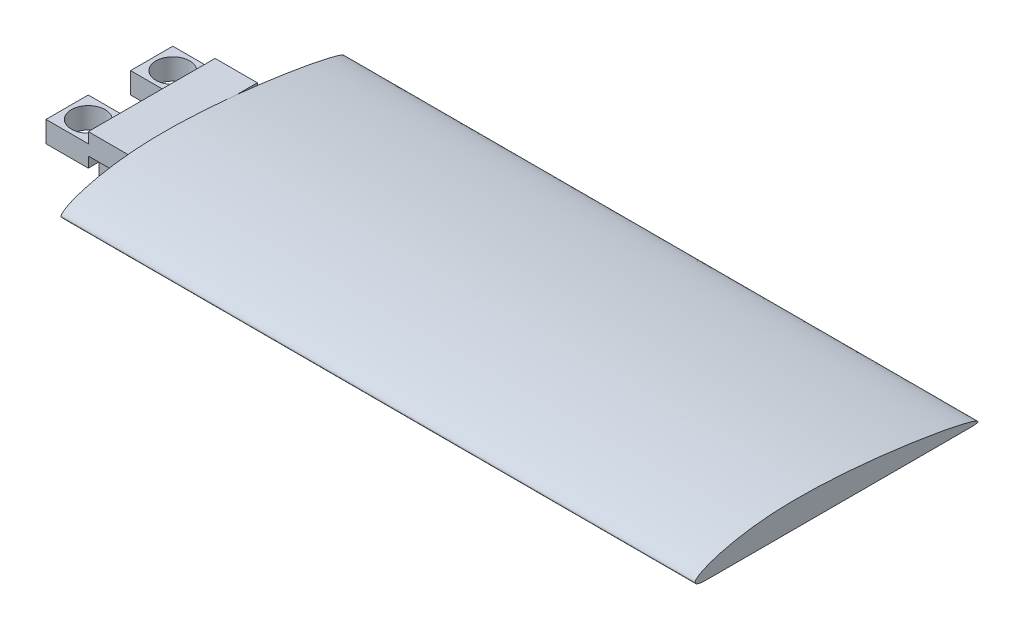
ISO-10303-21;
HEADER;
FILE_DESCRIPTION(('STEP AP214'),'2;1');
FILE_NAME('part.step','',(''),(''),'','','');
FILE_SCHEMA(('AUTOMOTIVE_DESIGN { 1 0 10303 214 1 1 1 1 }'));
ENDSEC;
DATA;
#1=APPLICATION_CONTEXT('core data for automotive mechanical design processes');
#2=APPLICATION_PROTOCOL_DEFINITION('international standard','automotive_design',2000,#1);
#3=PRODUCT_CONTEXT('',#1,'mechanical');
#4=PRODUCT('Part','Part','',(#3));
#5=PRODUCT_RELATED_PRODUCT_CATEGORY('part','',(#4));
#6=PRODUCT_DEFINITION_FORMATION('','',#4);
#7=PRODUCT_DEFINITION_CONTEXT('part definition',#1,'design');
#8=PRODUCT_DEFINITION('design','',#6,#7);
#9=PRODUCT_DEFINITION_SHAPE('','',#8);
#10=(LENGTH_UNIT() NAMED_UNIT(*) SI_UNIT(.MILLI.,.METRE.));
#11=(NAMED_UNIT(*) PLANE_ANGLE_UNIT() SI_UNIT($,.RADIAN.));
#12=(NAMED_UNIT(*) SI_UNIT($,.STERADIAN.) SOLID_ANGLE_UNIT());
#13=UNCERTAINTY_MEASURE_WITH_UNIT(LENGTH_MEASURE(1.E-05),#10,'distance_accuracy_value','');
#14=(GEOMETRIC_REPRESENTATION_CONTEXT(3) GLOBAL_UNCERTAINTY_ASSIGNED_CONTEXT((#13)) GLOBAL_UNIT_ASSIGNED_CONTEXT((#10,
#11,#12)) REPRESENTATION_CONTEXT('',''));
#15=CARTESIAN_POINT('',(0.,0.,0.));
#16=DIRECTION('',(0.,0.,1.));
#17=DIRECTION('',(1.,0.,0.));
#18=AXIS2_PLACEMENT_3D('',#15,#16,#17);
#19=CARTESIAN_POINT('',(15.,-5.,-22.5));
#20=DIRECTION('',(0.,0.,1.));
#21=DIRECTION('',(1.,0.,0.));
#22=AXIS2_PLACEMENT_3D('',#19,#20,#21);
#23=PLANE('',#22);
#24=DIRECTION('',(0.,1.,0.));
#25=VECTOR('',#24,1.);
#26=CARTESIAN_POINT('',(9.99999999999999,-5.,-22.5));
#27=LINE('',#26,#25);
#28=CARTESIAN_POINT('',(9.99999999999999,-5.,-22.5));
#29=VERTEX_POINT('',#28);
#30=CARTESIAN_POINT('',(9.99999999999999,5.,-22.5));
#31=VERTEX_POINT('',#30);
#32=EDGE_CURVE('E110',#29,#31,#27,.T.);
#33=ORIENTED_EDGE('',*,*,#32,.T.);
#34=DIRECTION('',(-1.,0.,0.));
#35=VECTOR('',#34,1.);
#36=CARTESIAN_POINT('',(15.,5.,-22.5));
#37=LINE('',#36,#35);
#38=CARTESIAN_POINT('',(15.,5.,-22.5));
#39=VERTEX_POINT('',#38);
#40=EDGE_CURVE('E12',#39,#31,#37,.T.);
#41=ORIENTED_EDGE('',*,*,#40,.F.);
#42=DIRECTION('',(0.,1.,0.));
#43=VECTOR('',#42,1.);
#44=CARTESIAN_POINT('',(15.,-5.,-22.5));
#45=LINE('',#44,#43);
#46=CARTESIAN_POINT('',(15.,-5.,-22.5));
#47=VERTEX_POINT('',#46);
#48=EDGE_CURVE('E98',#47,#39,#45,.T.);
#49=ORIENTED_EDGE('',*,*,#48,.F.);
#50=DIRECTION('',(-1.,0.,0.));
#51=VECTOR('',#50,1.);
#52=CARTESIAN_POINT('',(15.,-5.,-22.5));
#53=LINE('',#52,#51);
#54=EDGE_CURVE('E106',#47,#29,#53,.T.);
#55=ORIENTED_EDGE('',*,*,#54,.T.);
#56=EDGE_LOOP('',(#33,#41,#49,#55));
#57=FACE_BOUND('',#56,.T.);
#58=ADVANCED_FACE('F47',(#57),#23,.F.);
#59=CARTESIAN_POINT('',(15.,5.,-17.5));
#60=DIRECTION('',(0.,-1.,0.));
#61=DIRECTION('',(0.,0.,-1.));
#62=AXIS2_PLACEMENT_3D('',#59,#60,#61);
#63=PLANE('',#62);
#64=DIRECTION('',(0.,0.,1.));
#65=VECTOR('',#64,1.);
#66=CARTESIAN_POINT('',(9.99999999999999,5.,-17.5));
#67=LINE('',#66,#65);
#68=CARTESIAN_POINT('',(9.99999999999999,5.,-17.5));
#69=VERTEX_POINT('',#68);
#70=EDGE_CURVE('E102',#31,#69,#67,.T.);
#71=ORIENTED_EDGE('',*,*,#70,.T.);
#72=DIRECTION('',(-1.,0.,0.));
#73=VECTOR('',#72,1.);
#74=CARTESIAN_POINT('',(15.,5.,-17.5));
#75=LINE('',#74,#73);
#76=CARTESIAN_POINT('',(15.,5.,-17.5));
#77=VERTEX_POINT('',#76);
#78=EDGE_CURVE('E55',#77,#69,#75,.T.);
#79=ORIENTED_EDGE('',*,*,#78,.F.);
#80=DIRECTION('',(0.,0.,1.));
#81=VECTOR('',#80,1.);
#82=CARTESIAN_POINT('',(15.,5.,-17.5));
#83=LINE('',#82,#81);
#84=EDGE_CURVE('E93',#39,#77,#83,.T.);
#85=ORIENTED_EDGE('',*,*,#84,.F.);
#86=ORIENTED_EDGE('',*,*,#40,.T.);
#87=EDGE_LOOP('',(#71,#79,#85,#86));
#88=FACE_BOUND('',#87,.T.);
#89=ADVANCED_FACE('F101',(#88),#63,.F.);
#90=CARTESIAN_POINT('',(15.,-5.,-17.5));
#91=DIRECTION('',(0.,0.,-1.));
#92=DIRECTION('',(-1.,0.,0.));
#93=AXIS2_PLACEMENT_3D('',#90,#91,#92);
#94=PLANE('',#93);
#95=DIRECTION('',(0.,-1.,0.));
#96=VECTOR('',#95,1.);
#97=CARTESIAN_POINT('',(9.99999999999999,-5.,-17.5));
#98=LINE('',#97,#96);
#99=CARTESIAN_POINT('',(9.99999999999999,-5.,-17.5));
#100=VERTEX_POINT('',#99);
#101=EDGE_CURVE('E80',#69,#100,#98,.T.);
#102=ORIENTED_EDGE('',*,*,#101,.T.);
#103=DIRECTION('',(-1.,0.,0.));
#104=VECTOR('',#103,1.);
#105=CARTESIAN_POINT('',(15.,-5.,-17.5));
#106=LINE('',#105,#104);
#107=CARTESIAN_POINT('',(15.,-5.,-17.5));
#108=VERTEX_POINT('',#107);
#109=EDGE_CURVE('E103',#108,#100,#106,.T.);
#110=ORIENTED_EDGE('',*,*,#109,.F.);
#111=DIRECTION('',(0.,-1.,0.));
#112=VECTOR('',#111,1.);
#113=CARTESIAN_POINT('',(15.,-5.,-17.5));
#114=LINE('',#113,#112);
#115=EDGE_CURVE('E96',#77,#108,#114,.T.);
#116=ORIENTED_EDGE('',*,*,#115,.F.);
#117=ORIENTED_EDGE('',*,*,#78,.T.);
#118=EDGE_LOOP('',(#102,#110,#116,#117));
#119=FACE_BOUND('',#118,.T.);
#120=ADVANCED_FACE('F104',(#119),#94,.F.);
#121=CARTESIAN_POINT('',(15.,-5.,-17.5));
#122=DIRECTION('',(0.,1.,0.));
#123=DIRECTION('',(0.,0.,1.));
#124=AXIS2_PLACEMENT_3D('',#121,#122,#123);
#125=PLANE('',#124);
#126=DIRECTION('',(0.,0.,-1.));
#127=VECTOR('',#126,1.);
#128=CARTESIAN_POINT('',(9.99999999999999,-5.,-17.5));
#129=LINE('',#128,#127);
#130=EDGE_CURVE('E86',#100,#29,#129,.T.);
#131=ORIENTED_EDGE('',*,*,#130,.T.);
#132=ORIENTED_EDGE('',*,*,#54,.F.);
#133=DIRECTION('',(0.,0.,-1.));
#134=VECTOR('',#133,1.);
#135=CARTESIAN_POINT('',(15.,-5.,-17.5));
#136=LINE('',#135,#134);
#137=EDGE_CURVE('E63',#108,#47,#136,.T.);
#138=ORIENTED_EDGE('',*,*,#137,.F.);
#139=ORIENTED_EDGE('',*,*,#109,.T.);
#140=EDGE_LOOP('',(#131,#132,#138,#139));
#141=FACE_BOUND('',#140,.T.);
#142=ADVANCED_FACE('F117',(#141),#125,.F.);
#143=CARTESIAN_POINT('',(15.,0.,0.));
#144=DIRECTION('',(-1.,0.,0.));
#145=DIRECTION('',(0.,0.,1.));
#146=AXIS2_PLACEMENT_3D('',#143,#144,#145);
#147=PLANE('',#146);
#148=ORIENTED_EDGE('',*,*,#48,.T.);
#149=ORIENTED_EDGE('',*,*,#84,.T.);
#150=ORIENTED_EDGE('',*,*,#115,.T.);
#151=ORIENTED_EDGE('',*,*,#137,.T.);
#152=EDGE_LOOP('',(#148,#149,#150,#151));
#153=FACE_BOUND('',#152,.T.);
#154=ADVANCED_FACE('F94',(#153),#147,.F.);
#155=CARTESIAN_POINT('',(10.,0.,0.));
#156=DIRECTION('',(-1.,0.,0.));
#157=DIRECTION('',(0.,0.,1.));
#158=AXIS2_PLACEMENT_3D('',#155,#156,#157);
#159=PLANE('',#158);
#160=ORIENTED_EDGE('',*,*,#32,.F.);
#161=ORIENTED_EDGE('',*,*,#130,.F.);
#162=ORIENTED_EDGE('',*,*,#101,.F.);
#163=ORIENTED_EDGE('',*,*,#70,.F.);
#164=EDGE_LOOP('',(#160,#161,#162,#163));
#165=FACE_BOUND('',#164,.T.);
#166=ADVANCED_FACE('F120',(#165),#159,.T.);
#167=CLOSED_SHELL('',(#58,#89,#120,#142,#154,#166));
#168=MANIFOLD_SOLID_BREP('B2',#167);
#169=CARTESIAN_POINT('',(0.,5.,0.));
#170=DIRECTION('',(0.,-1.,0.));
#171=DIRECTION('',(0.,0.,-1.));
#172=AXIS2_PLACEMENT_3D('',#169,#170,#171);
#173=PLANE('',#172);
#174=DIRECTION('',(0.,0.,1.));
#175=VECTOR('',#174,1.);
#176=CARTESIAN_POINT('',(0.,5.,-15.));
#177=LINE('',#176,#175);
#178=CARTESIAN_POINT('',(0.,5.,-25.));
#179=VERTEX_POINT('',#178);
#180=CARTESIAN_POINT('',(0.,5.,-15.));
#181=VERTEX_POINT('',#180);
#182=EDGE_CURVE('E231',#179,#181,#177,.T.);
#183=ORIENTED_EDGE('',*,*,#182,.T.);
#184=DIRECTION('',(1.,0.,0.));
#185=VECTOR('',#184,1.);
#186=CARTESIAN_POINT('',(0.,5.,-15.));
#187=LINE('',#186,#185);
#188=CARTESIAN_POINT('',(9.99999999999999,5.,-15.));
#189=VERTEX_POINT('',#188);
#190=EDGE_CURVE('E226',#181,#189,#187,.T.);
#191=ORIENTED_EDGE('',*,*,#190,.T.);
#192=DIRECTION('',(0.,0.,-1.));
#193=VECTOR('',#192,1.);
#194=CARTESIAN_POINT('',(9.99999999999999,5.,-15.));
#195=LINE('',#194,#193);
#196=CARTESIAN_POINT('',(10.,5.,-25.));
#197=VERTEX_POINT('',#196);
#198=EDGE_CURVE('E229',#189,#197,#195,.T.);
#199=ORIENTED_EDGE('',*,*,#198,.T.);
#200=DIRECTION('',(-1.,0.,0.));
#201=VECTOR('',#200,1.);
#202=CARTESIAN_POINT('',(0.,5.,-25.));
#203=LINE('',#202,#201);
#204=EDGE_CURVE('E196',#197,#179,#203,.T.);
#205=ORIENTED_EDGE('',*,*,#204,.T.);
#206=EDGE_LOOP('',(#183,#191,#199,#205));
#207=FACE_BOUND('',#206,.T.);
#208=CARTESIAN_POINT('',(5.,5.,-20.));
#209=DIRECTION('',(0.,1.,0.));
#210=DIRECTION('',(0.,0.,-1.));
#211=AXIS2_PLACEMENT_3D('',#208,#209,#210);
#212=CIRCLE('',#211,4.);
#213=CARTESIAN_POINT('',(5.,5.,-24.));
#214=VERTEX_POINT('',#213);
#215=EDGE_CURVE('E246',#214,#214,#212,.T.);
#216=ORIENTED_EDGE('',*,*,#215,.F.);
#217=EDGE_LOOP('',(#216));
#218=FACE_BOUND('',#217,.T.);
#219=ADVANCED_FACE('F179',(#207,#218),#173,.F.);
#220=CARTESIAN_POINT('',(0.,0.,0.));
#221=DIRECTION('',(0.,-1.,0.));
#222=DIRECTION('',(0.,0.,-1.));
#223=AXIS2_PLACEMENT_3D('',#220,#221,#222);
#224=PLANE('',#223);
#225=DIRECTION('',(0.,0.,1.));
#226=VECTOR('',#225,1.);
#227=CARTESIAN_POINT('',(0.,0.,-15.));
#228=LINE('',#227,#226);
#229=CARTESIAN_POINT('',(0.,0.,-25.));
#230=VERTEX_POINT('',#229);
#231=CARTESIAN_POINT('',(0.,0.,-15.));
#232=VERTEX_POINT('',#231);
#233=EDGE_CURVE('E243',#230,#232,#228,.T.);
#234=ORIENTED_EDGE('',*,*,#233,.F.);
#235=DIRECTION('',(-1.,0.,0.));
#236=VECTOR('',#235,1.);
#237=CARTESIAN_POINT('',(0.,0.,-25.));
#238=LINE('',#237,#236);
#239=CARTESIAN_POINT('',(10.,0.,-25.));
#240=VERTEX_POINT('',#239);
#241=EDGE_CURVE('E219',#240,#230,#238,.T.);
#242=ORIENTED_EDGE('',*,*,#241,.F.);
#243=DIRECTION('',(0.,0.,-1.));
#244=VECTOR('',#243,1.);
#245=CARTESIAN_POINT('',(9.99999999999999,0.,-15.));
#246=LINE('',#245,#244);
#247=CARTESIAN_POINT('',(9.99999999999999,0.,-15.));
#248=VERTEX_POINT('',#247);
#249=EDGE_CURVE('E213',#248,#240,#246,.T.);
#250=ORIENTED_EDGE('',*,*,#249,.F.);
#251=DIRECTION('',(1.,0.,0.));
#252=VECTOR('',#251,1.);
#253=CARTESIAN_POINT('',(0.,0.,-15.));
#254=LINE('',#253,#252);
#255=EDGE_CURVE('E235',#232,#248,#254,.T.);
#256=ORIENTED_EDGE('',*,*,#255,.F.);
#257=EDGE_LOOP('',(#234,#242,#250,#256));
#258=FACE_BOUND('',#257,.T.);
#259=CARTESIAN_POINT('',(5.,0.,-20.));
#260=DIRECTION('',(0.,1.,0.));
#261=DIRECTION('',(0.,0.,-1.));
#262=AXIS2_PLACEMENT_3D('',#259,#260,#261);
#263=CIRCLE('',#262,4.);
#264=CARTESIAN_POINT('',(5.,0.,-24.));
#265=VERTEX_POINT('',#264);
#266=EDGE_CURVE('E258',#265,#265,#263,.T.);
#267=ORIENTED_EDGE('',*,*,#266,.T.);
#268=EDGE_LOOP('',(#267));
#269=FACE_BOUND('',#268,.T.);
#270=ADVANCED_FACE('F254',(#258,#269),#224,.T.);
#271=CARTESIAN_POINT('',(0.,5.,-15.));
#272=DIRECTION('',(1.,0.,0.));
#273=DIRECTION('',(0.,0.,-1.));
#274=AXIS2_PLACEMENT_3D('',#271,#272,#273);
#275=PLANE('',#274);
#276=ORIENTED_EDGE('',*,*,#233,.T.);
#277=DIRECTION('',(0.,-1.,0.));
#278=VECTOR('',#277,1.);
#279=CARTESIAN_POINT('',(0.,5.,-15.));
#280=LINE('',#279,#278);
#281=EDGE_CURVE('E45',#181,#232,#280,.T.);
#282=ORIENTED_EDGE('',*,*,#281,.F.);
#283=ORIENTED_EDGE('',*,*,#182,.F.);
#284=DIRECTION('',(0.,-1.,0.));
#285=VECTOR('',#284,1.);
#286=CARTESIAN_POINT('',(0.,5.,-25.));
#287=LINE('',#286,#285);
#288=EDGE_CURVE('E239',#179,#230,#287,.T.);
#289=ORIENTED_EDGE('',*,*,#288,.T.);
#290=EDGE_LOOP('',(#276,#282,#283,#289));
#291=FACE_BOUND('',#290,.T.);
#292=ADVANCED_FACE('F181',(#291),#275,.F.);
#293=CARTESIAN_POINT('',(0.,5.,-15.));
#294=DIRECTION('',(0.,0.,-1.));
#295=DIRECTION('',(-1.,0.,0.));
#296=AXIS2_PLACEMENT_3D('',#293,#294,#295);
#297=PLANE('',#296);
#298=ORIENTED_EDGE('',*,*,#255,.T.);
#299=DIRECTION('',(0.,-1.,0.));
#300=VECTOR('',#299,1.);
#301=CARTESIAN_POINT('',(9.99999999999999,5.,-15.));
#302=LINE('',#301,#300);
#303=EDGE_CURVE('E188',#189,#248,#302,.T.);
#304=ORIENTED_EDGE('',*,*,#303,.F.);
#305=ORIENTED_EDGE('',*,*,#190,.F.);
#306=ORIENTED_EDGE('',*,*,#281,.T.);
#307=EDGE_LOOP('',(#298,#304,#305,#306));
#308=FACE_BOUND('',#307,.T.);
#309=ADVANCED_FACE('F234',(#308),#297,.F.);
#310=CARTESIAN_POINT('',(9.99999999999999,5.,-15.));
#311=DIRECTION('',(-1.,0.,0.));
#312=DIRECTION('',(0.,0.,1.));
#313=AXIS2_PLACEMENT_3D('',#310,#311,#312);
#314=PLANE('',#313);
#315=ORIENTED_EDGE('',*,*,#249,.T.);
#316=DIRECTION('',(0.,-1.,0.));
#317=VECTOR('',#316,1.);
#318=CARTESIAN_POINT('',(10.,5.,-25.));
#319=LINE('',#318,#317);
#320=EDGE_CURVE('E236',#197,#240,#319,.T.);
#321=ORIENTED_EDGE('',*,*,#320,.F.);
#322=ORIENTED_EDGE('',*,*,#198,.F.);
#323=ORIENTED_EDGE('',*,*,#303,.T.);
#324=EDGE_LOOP('',(#315,#321,#322,#323));
#325=FACE_BOUND('',#324,.T.);
#326=ADVANCED_FACE('F237',(#325),#314,.F.);
#327=CARTESIAN_POINT('',(0.,5.,-25.));
#328=DIRECTION('',(0.,0.,1.));
#329=DIRECTION('',(1.,0.,0.));
#330=AXIS2_PLACEMENT_3D('',#327,#328,#329);
#331=PLANE('',#330);
#332=ORIENTED_EDGE('',*,*,#241,.T.);
#333=ORIENTED_EDGE('',*,*,#288,.F.);
#334=ORIENTED_EDGE('',*,*,#204,.F.);
#335=ORIENTED_EDGE('',*,*,#320,.T.);
#336=EDGE_LOOP('',(#332,#333,#334,#335));
#337=FACE_BOUND('',#336,.T.);
#338=ADVANCED_FACE('F251',(#337),#331,.F.);
#339=CARTESIAN_POINT('',(5.,5.,-20.));
#340=DIRECTION('',(0.,-1.,0.));
#341=DIRECTION('',(0.,0.,-1.));
#342=AXIS2_PLACEMENT_3D('',#339,#340,#341);
#343=CYLINDRICAL_SURFACE('',#342,4.);
#344=ORIENTED_EDGE('',*,*,#215,.T.);
#345=EDGE_LOOP('',(#344));
#346=FACE_BOUND('',#345,.T.);
#347=ORIENTED_EDGE('',*,*,#266,.F.);
#348=EDGE_LOOP('',(#347));
#349=FACE_BOUND('',#348,.T.);
#350=ADVANCED_FACE('F264',(#346,#349),#343,.F.);
#351=CLOSED_SHELL('',(#219,#270,#292,#309,#326,#338,#350));
#352=MANIFOLD_SOLID_BREP('B6',#351);
#353=CARTESIAN_POINT('',(20.,7.5,-25.));
#354=DIRECTION('',(-1.,0.,0.));
#355=DIRECTION('',(0.,0.,1.));
#356=AXIS2_PLACEMENT_3D('',#353,#354,#355);
#357=PLANE('',#356);
#358=CARTESIAN_POINT('',(20.,2.5,-43.5818633417016));
#359=CARTESIAN_POINT('',(20.,2.5,-54.109415672038));
#360=CARTESIAN_POINT('',(20.,14.5377672604346,5.82154619961291));
#361=CARTESIAN_POINT('',(20.,2.5,26.2287373231827));
#362=CARTESIAN_POINT('',(20.,2.5,18.5389838197817));
#363=B_SPLINE_CURVE_WITH_KNOTS('',3,(#358,#359,#360,#361,#362),.UNSPECIFIED.,.F.,.F.,(4,1,4),
(0.,0.583473653659747,1.),.UNSPECIFIED.);
#364=CARTESIAN_POINT('',(20.,6.94114038584259,-25.));
#365=VERTEX_POINT('',#364);
#366=CARTESIAN_POINT('',(20.,7.50000001951237,-20.0732175677515));
#367=VERTEX_POINT('',#366);
#368=EDGE_CURVE('E177',#365,#367,#363,.T.);
#369=ORIENTED_EDGE('',*,*,#368,.F.);
#370=DIRECTION('',(0.,-1.,0.));
#371=VECTOR('',#370,1.);
#372=CARTESIAN_POINT('',(20.,7.5,-25.));
#373=LINE('',#372,#371);
#374=CARTESIAN_POINT('',(20.,7.5,-25.));
#375=VERTEX_POINT('',#374);
#376=EDGE_CURVE('E490',#375,#365,#373,.T.);
#377=ORIENTED_EDGE('',*,*,#376,.F.);
#378=DIRECTION('',(0.,0.,-1.));
#379=VECTOR('',#378,1.);
#380=CARTESIAN_POINT('',(20.,7.5,-25.));
#381=LINE('',#380,#379);
#382=EDGE_CURVE('E477',#367,#375,#381,.T.);
#383=ORIENTED_EDGE('',*,*,#382,.F.);
#384=EDGE_LOOP('',(#369,#377,#383));
#385=FACE_BOUND('',#384,.T.);
#386=ADVANCED_FACE('F323',(#385),#357,.F.);
#387=CARTESIAN_POINT('',(10.,5.,-5.));
#388=DIRECTION('',(-1.,0.,0.));
#389=DIRECTION('',(0.,0.,1.));
#390=AXIS2_PLACEMENT_3D('',#387,#388,#389);
#391=PLANE('',#390);
#392=DIRECTION('',(0.,0.,1.));
#393=VECTOR('',#392,1.);
#394=CARTESIAN_POINT('',(10.,2.5,-25.));
#395=LINE('',#394,#393);
#396=CARTESIAN_POINT('',(10.,2.5,-5.));
#397=VERTEX_POINT('',#396);
#398=CARTESIAN_POINT('',(10.,2.5,-2.5));
#399=VERTEX_POINT('',#398);
#400=EDGE_CURVE('E465',#397,#399,#395,.T.);
#401=ORIENTED_EDGE('',*,*,#400,.T.);
#402=DIRECTION('',(0.,1.,0.));
#403=VECTOR('',#402,1.);
#404=CARTESIAN_POINT('',(10.,-5.,-2.5));
#405=LINE('',#404,#403);
#406=CARTESIAN_POINT('',(10.,0.,-2.5));
#407=VERTEX_POINT('',#406);
#408=EDGE_CURVE('E516',#407,#399,#405,.T.);
#409=ORIENTED_EDGE('',*,*,#408,.F.);
#410=DIRECTION('',(0.,0.,-1.));
#411=VECTOR('',#410,1.);
#412=CARTESIAN_POINT('',(10.,0.,-5.));
#413=LINE('',#412,#411);
#414=CARTESIAN_POINT('',(10.,0.,-5.));
#415=VERTEX_POINT('',#414);
#416=EDGE_CURVE('E529',#407,#415,#413,.T.);
#417=ORIENTED_EDGE('',*,*,#416,.T.);
#418=DIRECTION('',(0.,-1.,0.));
#419=VECTOR('',#418,1.);
#420=CARTESIAN_POINT('',(10.,5.,-5.));
#421=LINE('',#420,#419);
#422=EDGE_CURVE('E347',#397,#415,#421,.T.);
#423=ORIENTED_EDGE('',*,*,#422,.F.);
#424=EDGE_LOOP('',(#401,#409,#417,#423));
#425=FACE_BOUND('',#424,.T.);
#426=ADVANCED_FACE('F325',(#425),#391,.F.);
#427=CARTESIAN_POINT('',(10.,2.5,2.5));
#428=VERTEX_POINT('',#427);
#429=CARTESIAN_POINT('',(10.,2.5,5.));
#430=VERTEX_POINT('',#429);
#431=EDGE_CURVE('E463',#428,#430,#395,.T.);
#432=ORIENTED_EDGE('',*,*,#431,.T.);
#433=DIRECTION('',(0.,-1.,0.));
#434=VECTOR('',#433,1.);
#435=CARTESIAN_POINT('',(10.,5.,5.));
#436=LINE('',#435,#434);
#437=CARTESIAN_POINT('',(10.,0.,5.));
#438=VERTEX_POINT('',#437);
#439=EDGE_CURVE('E541',#430,#438,#436,.T.);
#440=ORIENTED_EDGE('',*,*,#439,.T.);
#441=CARTESIAN_POINT('',(10.,0.,2.5));
#442=VERTEX_POINT('',#441);
#443=EDGE_CURVE('E542',#438,#442,#413,.T.);
#444=ORIENTED_EDGE('',*,*,#443,.T.);
#445=DIRECTION('',(0.,-1.,0.));
#446=VECTOR('',#445,1.);
#447=CARTESIAN_POINT('',(10.,-5.,2.5));
#448=LINE('',#447,#446);
#449=EDGE_CURVE('E517',#428,#442,#448,.T.);
#450=ORIENTED_EDGE('',*,*,#449,.F.);
#451=EDGE_LOOP('',(#432,#440,#444,#450));
#452=FACE_BOUND('',#451,.T.);
#453=ADVANCED_FACE('F607',(#452),#391,.F.);
#454=CARTESIAN_POINT('',(0.,5.,0.));
#455=DIRECTION('',(0.,1.,0.));
#456=DIRECTION('',(0.,0.,1.));
#457=AXIS2_PLACEMENT_3D('',#454,#455,#456);
#458=PLANE('',#457);
#459=CARTESIAN_POINT('',(5.,5.,0.));
#460=DIRECTION('',(0.,1.,0.));
#461=DIRECTION('',(0.,0.,1.));
#462=AXIS2_PLACEMENT_3D('',#459,#460,#461);
#463=CIRCLE('',#462,4.);
#464=CARTESIAN_POINT('',(5.,5.,4.));
#465=VERTEX_POINT('',#464);
#466=EDGE_CURVE('E526',#465,#465,#463,.T.);
#467=ORIENTED_EDGE('',*,*,#466,.F.);
#468=EDGE_LOOP('',(#467));
#469=FACE_BOUND('',#468,.T.);
#470=DIRECTION('',(0.,0.,-1.));
#471=VECTOR('',#470,1.);
#472=CARTESIAN_POINT('',(10.,5.,-5.));
#473=LINE('',#472,#471);
#474=CARTESIAN_POINT('',(10.,5.,5.));
#475=VERTEX_POINT('',#474);
#476=CARTESIAN_POINT('',(10.,5.,-5.));
#477=VERTEX_POINT('',#476);
#478=EDGE_CURVE('E532',#475,#477,#473,.T.);
#479=ORIENTED_EDGE('',*,*,#478,.T.);
#480=DIRECTION('',(-1.,0.,0.));
#481=VECTOR('',#480,1.);
#482=CARTESIAN_POINT('',(0.,5.,-5.));
#483=LINE('',#482,#481);
#484=CARTESIAN_POINT('',(0.,5.,-5.));
#485=VERTEX_POINT('',#484);
#486=EDGE_CURVE('E534',#477,#485,#483,.T.);
#487=ORIENTED_EDGE('',*,*,#486,.T.);
#488=DIRECTION('',(0.,0.,1.));
#489=VECTOR('',#488,1.);
#490=CARTESIAN_POINT('',(0.,5.,-5.));
#491=LINE('',#490,#489);
#492=CARTESIAN_POINT('',(0.,5.,5.));
#493=VERTEX_POINT('',#492);
#494=EDGE_CURVE('E537',#485,#493,#491,.T.);
#495=ORIENTED_EDGE('',*,*,#494,.T.);
#496=DIRECTION('',(1.,0.,0.));
#497=VECTOR('',#496,1.);
#498=CARTESIAN_POINT('',(0.,5.,5.));
#499=LINE('',#498,#497);
#500=EDGE_CURVE('E539',#493,#475,#499,.T.);
#501=ORIENTED_EDGE('',*,*,#500,.T.);
#502=EDGE_LOOP('',(#479,#487,#495,#501));
#503=FACE_BOUND('',#502,.T.);
#504=ADVANCED_FACE('F587',(#469,#503),#458,.T.);
#505=CARTESIAN_POINT('',(15.,-5.,-2.5));
#506=DIRECTION('',(0.,0.,1.));
#507=DIRECTION('',(1.,0.,0.));
#508=AXIS2_PLACEMENT_3D('',#505,#506,#507);
#509=PLANE('',#508);
#510=DIRECTION('',(-1.,0.,0.));
#511=VECTOR('',#510,1.);
#512=CARTESIAN_POINT('',(15.,2.5,-2.5));
#513=LINE('',#512,#511);
#514=CARTESIAN_POINT('',(15.,2.5,-2.5));
#515=VERTEX_POINT('',#514);
#516=EDGE_CURVE('E501',#515,#399,#513,.T.);
#517=ORIENTED_EDGE('',*,*,#516,.F.);
#518=DIRECTION('',(0.,1.,0.));
#519=VECTOR('',#518,1.);
#520=CARTESIAN_POINT('',(15.,-5.,-2.5));
#521=LINE('',#520,#519);
#522=CARTESIAN_POINT('',(15.,-5.,-2.5));
#523=VERTEX_POINT('',#522);
#524=EDGE_CURVE('E505',#523,#515,#521,.T.);
#525=ORIENTED_EDGE('',*,*,#524,.F.);
#526=DIRECTION('',(-1.,0.,0.));
#527=VECTOR('',#526,1.);
#528=CARTESIAN_POINT('',(15.,-5.,-2.5));
#529=LINE('',#528,#527);
#530=CARTESIAN_POINT('',(10.,-5.,-2.5));
#531=VERTEX_POINT('',#530);
#532=EDGE_CURVE('E512',#523,#531,#529,.T.);
#533=ORIENTED_EDGE('',*,*,#532,.T.);
#534=EDGE_CURVE('E504',#531,#407,#405,.T.);
#535=ORIENTED_EDGE('',*,*,#534,.T.);
#536=ORIENTED_EDGE('',*,*,#408,.T.);
#537=EDGE_LOOP('',(#517,#525,#533,#535,#536));
#538=FACE_BOUND('',#537,.T.);
#539=ADVANCED_FACE('F597',(#538),#509,.F.);
#540=CARTESIAN_POINT('',(15.,-5.,2.49999999999999));
#541=DIRECTION('',(0.,0.,-1.));
#542=DIRECTION('',(-1.,0.,0.));
#543=AXIS2_PLACEMENT_3D('',#540,#541,#542);
#544=PLANE('',#543);
#545=DIRECTION('',(1.,0.,0.));
#546=VECTOR('',#545,1.);
#547=CARTESIAN_POINT('',(15.,2.5,2.49999999999999));
#548=LINE('',#547,#546);
#549=CARTESIAN_POINT('',(15.,2.5,2.49999999999999));
#550=VERTEX_POINT('',#549);
#551=EDGE_CURVE('E498',#428,#550,#548,.T.);
#552=ORIENTED_EDGE('',*,*,#551,.F.);
#553=ORIENTED_EDGE('',*,*,#449,.T.);
#554=CARTESIAN_POINT('',(10.,-5.,2.5));
#555=VERTEX_POINT('',#554);
#556=EDGE_CURVE('E515',#442,#555,#448,.T.);
#557=ORIENTED_EDGE('',*,*,#556,.T.);
#558=DIRECTION('',(-1.,0.,0.));
#559=VECTOR('',#558,1.);
#560=CARTESIAN_POINT('',(15.,-5.,2.49999999999999));
#561=LINE('',#560,#559);
#562=CARTESIAN_POINT('',(15.,-5.,2.49999999999999));
#563=VERTEX_POINT('',#562);
#564=EDGE_CURVE('E522',#563,#555,#561,.T.);
#565=ORIENTED_EDGE('',*,*,#564,.F.);
#566=DIRECTION('',(0.,-1.,0.));
#567=VECTOR('',#566,1.);
#568=CARTESIAN_POINT('',(15.,-5.,2.49999999999999));
#569=LINE('',#568,#567);
#570=EDGE_CURVE('E507',#550,#563,#569,.T.);
#571=ORIENTED_EDGE('',*,*,#570,.F.);
#572=EDGE_LOOP('',(#552,#553,#557,#565,#571));
#573=FACE_BOUND('',#572,.T.);
#574=ADVANCED_FACE('F648',(#573),#544,.F.);
#575=CARTESIAN_POINT('',(15.,0.,0.));
#576=DIRECTION('',(-1.,0.,0.));
#577=DIRECTION('',(0.,0.,1.));
#578=AXIS2_PLACEMENT_3D('',#575,#576,#577);
#579=PLANE('',#578);
#580=DIRECTION('',(0.,0.,-1.));
#581=VECTOR('',#580,1.);
#582=CARTESIAN_POINT('',(15.,2.5,0.));
#583=LINE('',#582,#581);
#584=EDGE_CURVE('E327',#550,#515,#583,.T.);
#585=ORIENTED_EDGE('',*,*,#584,.F.);
#586=ORIENTED_EDGE('',*,*,#570,.T.);
#587=DIRECTION('',(0.,0.,-1.));
#588=VECTOR('',#587,1.);
#589=CARTESIAN_POINT('',(15.,-5.,2.49999999999999));
#590=LINE('',#589,#588);
#591=EDGE_CURVE('E510',#563,#523,#590,.T.);
#592=ORIENTED_EDGE('',*,*,#591,.T.);
#593=ORIENTED_EDGE('',*,*,#524,.T.);
#594=EDGE_LOOP('',(#585,#586,#592,#593));
#595=FACE_BOUND('',#594,.T.);
#596=ADVANCED_FACE('F645',(#595),#579,.F.);
#597=CARTESIAN_POINT('',(0.,0.,0.));
#598=DIRECTION('',(0.,1.,0.));
#599=DIRECTION('',(0.,0.,1.));
#600=AXIS2_PLACEMENT_3D('',#597,#598,#599);
#601=PLANE('',#600);
#602=ORIENTED_EDGE('',*,*,#443,.F.);
#603=DIRECTION('',(1.,0.,0.));
#604=VECTOR('',#603,1.);
#605=CARTESIAN_POINT('',(0.,0.,5.));
#606=LINE('',#605,#604);
#607=CARTESIAN_POINT('',(0.,0.,5.));
#608=VERTEX_POINT('',#607);
#609=EDGE_CURVE('E535',#608,#438,#606,.T.);
#610=ORIENTED_EDGE('',*,*,#609,.F.);
#611=DIRECTION('',(0.,0.,1.));
#612=VECTOR('',#611,1.);
#613=CARTESIAN_POINT('',(0.,0.,-5.));
#614=LINE('',#613,#612);
#615=CARTESIAN_POINT('',(0.,0.,-5.));
#616=VERTEX_POINT('',#615);
#617=EDGE_CURVE('E548',#616,#608,#614,.T.);
#618=ORIENTED_EDGE('',*,*,#617,.F.);
#619=DIRECTION('',(-1.,0.,0.));
#620=VECTOR('',#619,1.);
#621=CARTESIAN_POINT('',(0.,0.,-5.));
#622=LINE('',#621,#620);
#623=EDGE_CURVE('E545',#415,#616,#622,.T.);
#624=ORIENTED_EDGE('',*,*,#623,.F.);
#625=ORIENTED_EDGE('',*,*,#416,.F.);
#626=EDGE_CURVE('E546',#442,#407,#413,.T.);
#627=ORIENTED_EDGE('',*,*,#626,.F.);
#628=EDGE_LOOP('',(#602,#610,#618,#624,#625,#627));
#629=FACE_BOUND('',#628,.T.);
#630=CARTESIAN_POINT('',(5.,0.,0.));
#631=DIRECTION('',(0.,1.,0.));
#632=DIRECTION('',(0.,0.,1.));
#633=AXIS2_PLACEMENT_3D('',#630,#631,#632);
#634=CIRCLE('',#633,4.);
#635=CARTESIAN_POINT('',(5.,0.,4.));
#636=VERTEX_POINT('',#635);
#637=EDGE_CURVE('E525',#636,#636,#634,.T.);
#638=ORIENTED_EDGE('',*,*,#637,.T.);
#639=EDGE_LOOP('',(#638));
#640=FACE_BOUND('',#639,.T.);
#641=ADVANCED_FACE('F573',(#629,#640),#601,.F.);
#642=CARTESIAN_POINT('',(0.,5.,-5.));
#643=DIRECTION('',(0.,0.,1.));
#644=DIRECTION('',(1.,0.,0.));
#645=AXIS2_PLACEMENT_3D('',#642,#643,#644);
#646=PLANE('',#645);
#647=ORIENTED_EDGE('',*,*,#623,.T.);
#648=DIRECTION('',(0.,-1.,0.));
#649=VECTOR('',#648,1.);
#650=CARTESIAN_POINT('',(0.,5.,-5.));
#651=LINE('',#650,#649);
#652=EDGE_CURVE('E556',#485,#616,#651,.T.);
#653=ORIENTED_EDGE('',*,*,#652,.F.);
#654=ORIENTED_EDGE('',*,*,#486,.F.);
#655=EDGE_CURVE('E558',#477,#397,#421,.T.);
#656=ORIENTED_EDGE('',*,*,#655,.T.);
#657=ORIENTED_EDGE('',*,*,#422,.T.);
#658=EDGE_LOOP('',(#647,#653,#654,#656,#657));
#659=FACE_BOUND('',#658,.T.);
#660=ADVANCED_FACE('F564',(#659),#646,.F.);
#661=CARTESIAN_POINT('',(0.,5.,-5.));
#662=DIRECTION('',(1.,0.,0.));
#663=DIRECTION('',(0.,0.,-1.));
#664=AXIS2_PLACEMENT_3D('',#661,#662,#663);
#665=PLANE('',#664);
#666=ORIENTED_EDGE('',*,*,#617,.T.);
#667=DIRECTION('',(0.,-1.,0.));
#668=VECTOR('',#667,1.);
#669=CARTESIAN_POINT('',(0.,5.,5.));
#670=LINE('',#669,#668);
#671=EDGE_CURVE('E553',#493,#608,#670,.T.);
#672=ORIENTED_EDGE('',*,*,#671,.F.);
#673=ORIENTED_EDGE('',*,*,#494,.F.);
#674=ORIENTED_EDGE('',*,*,#652,.T.);
#675=EDGE_LOOP('',(#666,#672,#673,#674));
#676=FACE_BOUND('',#675,.T.);
#677=ADVANCED_FACE('F578',(#676),#665,.F.);
#678=CARTESIAN_POINT('',(0.,5.,5.));
#679=DIRECTION('',(0.,0.,-1.));
#680=DIRECTION('',(-1.,0.,0.));
#681=AXIS2_PLACEMENT_3D('',#678,#679,#680);
#682=PLANE('',#681);
#683=ORIENTED_EDGE('',*,*,#609,.T.);
#684=ORIENTED_EDGE('',*,*,#439,.F.);
#685=DIRECTION('',(1.,0.,0.));
#686=VECTOR('',#685,1.);
#687=CARTESIAN_POINT('',(10.,2.5,5.));
#688=LINE('',#687,#686);
#689=CARTESIAN_POINT('',(20.,2.5,5.));
#690=VERTEX_POINT('',#689);
#691=EDGE_CURVE('E484',#430,#690,#688,.T.);
#692=ORIENTED_EDGE('',*,*,#691,.T.);
#693=DIRECTION('',(0.,-1.,0.));
#694=VECTOR('',#693,1.);
#695=CARTESIAN_POINT('',(20.,7.5,5.));
#696=LINE('',#695,#694);
#697=CARTESIAN_POINT('',(20.,7.5,5.));
#698=VERTEX_POINT('',#697);
#699=EDGE_CURVE('E492',#698,#690,#696,.T.);
#700=ORIENTED_EDGE('',*,*,#699,.F.);
#701=DIRECTION('',(1.,0.,0.));
#702=VECTOR('',#701,1.);
#703=CARTESIAN_POINT('',(10.,7.5,5.));
#704=LINE('',#703,#702);
#705=CARTESIAN_POINT('',(10.,7.5,5.));
#706=VERTEX_POINT('',#705);
#707=EDGE_CURVE('E474',#706,#698,#704,.T.);
#708=ORIENTED_EDGE('',*,*,#707,.F.);
#709=DIRECTION('',(0.,-1.,0.));
#710=VECTOR('',#709,1.);
#711=CARTESIAN_POINT('',(10.,7.5,5.));
#712=LINE('',#711,#710);
#713=EDGE_CURVE('E495',#706,#475,#712,.T.);
#714=ORIENTED_EDGE('',*,*,#713,.T.);
#715=ORIENTED_EDGE('',*,*,#500,.F.);
#716=ORIENTED_EDGE('',*,*,#671,.T.);
#717=EDGE_LOOP('',(#683,#684,#692,#700,#708,#714,#715,#716));
#718=FACE_BOUND('',#717,.T.);
#719=ADVANCED_FACE('F582',(#718),#682,.F.);
#720=CARTESIAN_POINT('',(5.,5.,0.));
#721=DIRECTION('',(0.,-1.,0.));
#722=DIRECTION('',(0.,0.,-1.));
#723=AXIS2_PLACEMENT_3D('',#720,#721,#722);
#724=CYLINDRICAL_SURFACE('',#723,4.);
#725=ORIENTED_EDGE('',*,*,#466,.T.);
#726=EDGE_LOOP('',(#725));
#727=FACE_BOUND('',#726,.T.);
#728=ORIENTED_EDGE('',*,*,#637,.F.);
#729=EDGE_LOOP('',(#728));
#730=FACE_BOUND('',#729,.T.);
#731=ADVANCED_FACE('F655',(#727,#730),#724,.F.);
#732=CARTESIAN_POINT('',(15.,-5.,2.49999999999999));
#733=DIRECTION('',(0.,1.,0.));
#734=DIRECTION('',(0.,0.,1.));
#735=AXIS2_PLACEMENT_3D('',#732,#733,#734);
#736=PLANE('',#735);
#737=DIRECTION('',(0.,0.,-1.));
#738=VECTOR('',#737,1.);
#739=CARTESIAN_POINT('',(10.,-5.,2.5));
#740=LINE('',#739,#738);
#741=EDGE_CURVE('E508',#555,#531,#740,.T.);
#742=ORIENTED_EDGE('',*,*,#741,.T.);
#743=ORIENTED_EDGE('',*,*,#532,.F.);
#744=ORIENTED_EDGE('',*,*,#591,.F.);
#745=ORIENTED_EDGE('',*,*,#564,.T.);
#746=EDGE_LOOP('',(#742,#743,#744,#745));
#747=FACE_BOUND('',#746,.T.);
#748=ADVANCED_FACE('F652',(#747),#736,.F.);
#749=CARTESIAN_POINT('',(10.,0.,0.));
#750=DIRECTION('',(-1.,0.,0.));
#751=DIRECTION('',(0.,0.,1.));
#752=AXIS2_PLACEMENT_3D('',#749,#750,#751);
#753=PLANE('',#752);
#754=ORIENTED_EDGE('',*,*,#556,.F.);
#755=ORIENTED_EDGE('',*,*,#626,.T.);
#756=ORIENTED_EDGE('',*,*,#534,.F.);
#757=ORIENTED_EDGE('',*,*,#741,.F.);
#758=EDGE_LOOP('',(#754,#755,#756,#757));
#759=FACE_BOUND('',#758,.T.);
#760=ADVANCED_FACE('F604',(#759),#753,.T.);
#761=CARTESIAN_POINT('',(10.,7.5,-25.));
#762=DIRECTION('',(1.,0.,0.));
#763=DIRECTION('',(0.,0.,-1.));
#764=AXIS2_PLACEMENT_3D('',#761,#762,#763);
#765=PLANE('',#764);
#766=ORIENTED_EDGE('',*,*,#478,.F.);
#767=ORIENTED_EDGE('',*,*,#713,.F.);
#768=DIRECTION('',(0.,0.,1.));
#769=VECTOR('',#768,1.);
#770=CARTESIAN_POINT('',(10.,7.5,-25.));
#771=LINE('',#770,#769);
#772=CARTESIAN_POINT('',(10.,7.5,-25.));
#773=VERTEX_POINT('',#772);
#774=EDGE_CURVE('E471',#773,#706,#771,.T.);
#775=ORIENTED_EDGE('',*,*,#774,.F.);
#776=DIRECTION('',(0.,-1.,0.));
#777=VECTOR('',#776,1.);
#778=CARTESIAN_POINT('',(10.,7.5,-25.));
#779=LINE('',#778,#777);
#780=CARTESIAN_POINT('',(10.,2.5,-25.));
#781=VERTEX_POINT('',#780);
#782=EDGE_CURVE('E481',#773,#781,#779,.T.);
#783=ORIENTED_EDGE('',*,*,#782,.T.);
#784=EDGE_CURVE('E467',#781,#397,#395,.T.);
#785=ORIENTED_EDGE('',*,*,#784,.T.);
#786=ORIENTED_EDGE('',*,*,#655,.F.);
#787=EDGE_LOOP('',(#766,#767,#775,#783,#785,#786));
#788=FACE_BOUND('',#787,.T.);
#789=ADVANCED_FACE('F589',(#788),#765,.F.);
#790=CARTESIAN_POINT('',(0.,2.5,0.));
#791=DIRECTION('',(0.,1.,0.));
#792=DIRECTION('',(0.,0.,1.));
#793=AXIS2_PLACEMENT_3D('',#790,#791,#792);
#794=PLANE('',#793);
#795=ORIENTED_EDGE('',*,*,#584,.T.);
#796=ORIENTED_EDGE('',*,*,#516,.T.);
#797=ORIENTED_EDGE('',*,*,#400,.F.);
#798=ORIENTED_EDGE('',*,*,#784,.F.);
#799=DIRECTION('',(-1.,0.,0.));
#800=VECTOR('',#799,1.);
#801=CARTESIAN_POINT('',(10.,2.5,-25.));
#802=LINE('',#801,#800);
#803=CARTESIAN_POINT('',(20.,2.5,-25.));
#804=VERTEX_POINT('',#803);
#805=EDGE_CURVE('E475',#804,#781,#802,.T.);
#806=ORIENTED_EDGE('',*,*,#805,.F.);
#807=DIRECTION('',(0.,0.,-1.));
#808=VECTOR('',#807,1.);
#809=CARTESIAN_POINT('',(20.,2.5,18.5389838197817));
#810=LINE('',#809,#808);
#811=CARTESIAN_POINT('',(20.,2.5,-43.5818633417016));
#812=VERTEX_POINT('',#811);
#813=EDGE_CURVE('E612',#804,#812,#810,.T.);
#814=ORIENTED_EDGE('',*,*,#813,.T.);
#815=DIRECTION('',(-1.,0.,0.));
#816=VECTOR('',#815,1.);
#817=CARTESIAN_POINT('',(170.,2.5,-43.5818633417016));
#818=LINE('',#817,#816);
#819=CARTESIAN_POINT('',(170.,2.5,-43.5818633417016));
#820=VERTEX_POINT('',#819);
#821=EDGE_CURVE('E450',#820,#812,#818,.T.);
#822=ORIENTED_EDGE('',*,*,#821,.F.);
#823=DIRECTION('',(0.,0.,-1.));
#824=VECTOR('',#823,1.);
#825=CARTESIAN_POINT('',(170.,2.5,18.5389838197817));
#826=LINE('',#825,#824);
#827=CARTESIAN_POINT('',(170.,2.5,18.5389838197817));
#828=VERTEX_POINT('',#827);
#829=EDGE_CURVE('E442',#828,#820,#826,.T.);
#830=ORIENTED_EDGE('',*,*,#829,.F.);
#831=DIRECTION('',(-1.,0.,0.));
#832=VECTOR('',#831,1.);
#833=CARTESIAN_POINT('',(170.,2.5,18.5389838197817));
#834=LINE('',#833,#832);
#835=CARTESIAN_POINT('',(20.,2.5,18.5389838197817));
#836=VERTEX_POINT('',#835);
#837=EDGE_CURVE('E448',#828,#836,#834,.T.);
#838=ORIENTED_EDGE('',*,*,#837,.T.);
#839=EDGE_CURVE('E457',#836,#690,#810,.T.);
#840=ORIENTED_EDGE('',*,*,#839,.T.);
#841=ORIENTED_EDGE('',*,*,#691,.F.);
#842=ORIENTED_EDGE('',*,*,#431,.F.);
#843=ORIENTED_EDGE('',*,*,#551,.T.);
#844=EDGE_LOOP('',(#795,#796,#797,#798,#806,#814,#822,#830,#838,#840,#841,#842,#843));
#845=FACE_BOUND('',#844,.T.);
#846=ADVANCED_FACE('F445',(#845),#794,.F.);
#847=CARTESIAN_POINT('',(10.,7.5,-25.));
#848=DIRECTION('',(0.,0.,1.));
#849=DIRECTION('',(1.,0.,0.));
#850=AXIS2_PLACEMENT_3D('',#847,#848,#849);
#851=PLANE('',#850);
#852=ORIENTED_EDGE('',*,*,#805,.T.);
#853=ORIENTED_EDGE('',*,*,#782,.F.);
#854=DIRECTION('',(-1.,0.,0.));
#855=VECTOR('',#854,1.);
#856=CARTESIAN_POINT('',(10.,7.5,-25.));
#857=LINE('',#856,#855);
#858=EDGE_CURVE('E480',#375,#773,#857,.T.);
#859=ORIENTED_EDGE('',*,*,#858,.F.);
#860=ORIENTED_EDGE('',*,*,#376,.T.);
#861=EDGE_CURVE('E489',#365,#804,#373,.T.);
#862=ORIENTED_EDGE('',*,*,#861,.T.);
#863=EDGE_LOOP('',(#852,#853,#859,#860,#862));
#864=FACE_BOUND('',#863,.T.);
#865=ADVANCED_FACE('F634',(#864),#851,.F.);
#866=CARTESIAN_POINT('',(0.,7.5,0.));
#867=DIRECTION('',(0.,1.,0.));
#868=DIRECTION('',(0.,0.,1.));
#869=AXIS2_PLACEMENT_3D('',#866,#867,#868);
#870=PLANE('',#869);
#871=ORIENTED_EDGE('',*,*,#774,.T.);
#872=ORIENTED_EDGE('',*,*,#707,.T.);
#873=EDGE_CURVE('E478',#698,#367,#381,.T.);
#874=ORIENTED_EDGE('',*,*,#873,.T.);
#875=ORIENTED_EDGE('',*,*,#382,.T.);
#876=ORIENTED_EDGE('',*,*,#858,.T.);
#877=EDGE_LOOP('',(#871,#872,#874,#875,#876));
#878=FACE_BOUND('',#877,.T.);
#879=ADVANCED_FACE('F631',(#878),#870,.T.);
#880=CARTESIAN_POINT('',(20.,8.39569452755327,-7.51523728594603));
#881=DIRECTION('',(1.,0.,0.));
#882=DIRECTION('',(0.,1.,0.));
#883=AXIS2_PLACEMENT_3D('',#880,#881,#882);
#884=PLANE('',#883);
#885=ORIENTED_EDGE('',*,*,#861,.F.);
#886=EDGE_CURVE('E333',#812,#365,#363,.T.);
#887=ORIENTED_EDGE('',*,*,#886,.F.);
#888=ORIENTED_EDGE('',*,*,#813,.F.);
#889=EDGE_LOOP('',(#885,#887,#888));
#890=FACE_BOUND('',#889,.T.);
#891=ADVANCED_FACE('F628',(#890),#884,.F.);
#892=CARTESIAN_POINT('',(170.,2.5,-43.5818633417016));
#893=CARTESIAN_POINT('',(170.,2.5,-54.109415672038));
#894=CARTESIAN_POINT('',(170.,14.5377672604346,5.8215461996129));
#895=CARTESIAN_POINT('',(170.,2.5,26.2287373231827));
#896=CARTESIAN_POINT('',(170.,2.5,18.5389838197817));
#897=B_SPLINE_CURVE_WITH_KNOTS('',3,(#892,#893,#894,#895,#896),.UNSPECIFIED.,.F.,.F.,(4,1,4),
(0.,0.583473653659747,1.),.UNSPECIFIED.);
#898=DIRECTION('',(-1.,0.,0.));
#899=VECTOR('',#898,1.);
#900=SURFACE_OF_LINEAR_EXTRUSION('',#897,#899);
#901=ORIENTED_EDGE('',*,*,#886,.T.);
#902=ORIENTED_EDGE('',*,*,#368,.T.);
#903=EDGE_CURVE('E334',#367,#836,#363,.T.);
#904=ORIENTED_EDGE('',*,*,#903,.T.);
#905=ORIENTED_EDGE('',*,*,#837,.F.);
#906=EDGE_CURVE('E453',#820,#828,#897,.T.);
#907=ORIENTED_EDGE('',*,*,#906,.F.);
#908=ORIENTED_EDGE('',*,*,#821,.T.);
#909=EDGE_LOOP('',(#901,#902,#904,#905,#907,#908));
#910=FACE_BOUND('',#909,.T.);
#911=ADVANCED_FACE('F460',(#910),#900,.F.);
#912=CARTESIAN_POINT('',(170.,8.39569452755327,-7.51523728594604));
#913=DIRECTION('',(1.,0.,0.));
#914=DIRECTION('',(0.,1.,0.));
#915=AXIS2_PLACEMENT_3D('',#912,#913,#914);
#916=PLANE('',#915);
#917=ORIENTED_EDGE('',*,*,#906,.T.);
#918=ORIENTED_EDGE('',*,*,#829,.T.);
#919=EDGE_LOOP('',(#917,#918));
#920=FACE_BOUND('',#919,.T.);
#921=ADVANCED_FACE('F455',(#920),#916,.T.);
#922=ORIENTED_EDGE('',*,*,#873,.F.);
#923=ORIENTED_EDGE('',*,*,#699,.T.);
#924=ORIENTED_EDGE('',*,*,#839,.F.);
#925=ORIENTED_EDGE('',*,*,#903,.F.);
#926=EDGE_LOOP('',(#922,#923,#924,#925));
#927=FACE_BOUND('',#926,.T.);
#928=ADVANCED_FACE('F629',(#927),#884,.F.);
#929=CLOSED_SHELL('',(#386,#426,#453,#504,#539,#574,#596,#641,#660,#677,#719,#731,#748,#760,
#789,#846,#865,#879,#891,#911,#921,#928));
#930=MANIFOLD_SOLID_BREP('B39',#929);
#931=ADVANCED_BREP_SHAPE_REPRESENTATION('',(#18,#168,#352,#930),#14);
#932=SHAPE_DEFINITION_REPRESENTATION(#9,#931);
ENDSEC;
END-ISO-10303-21;
